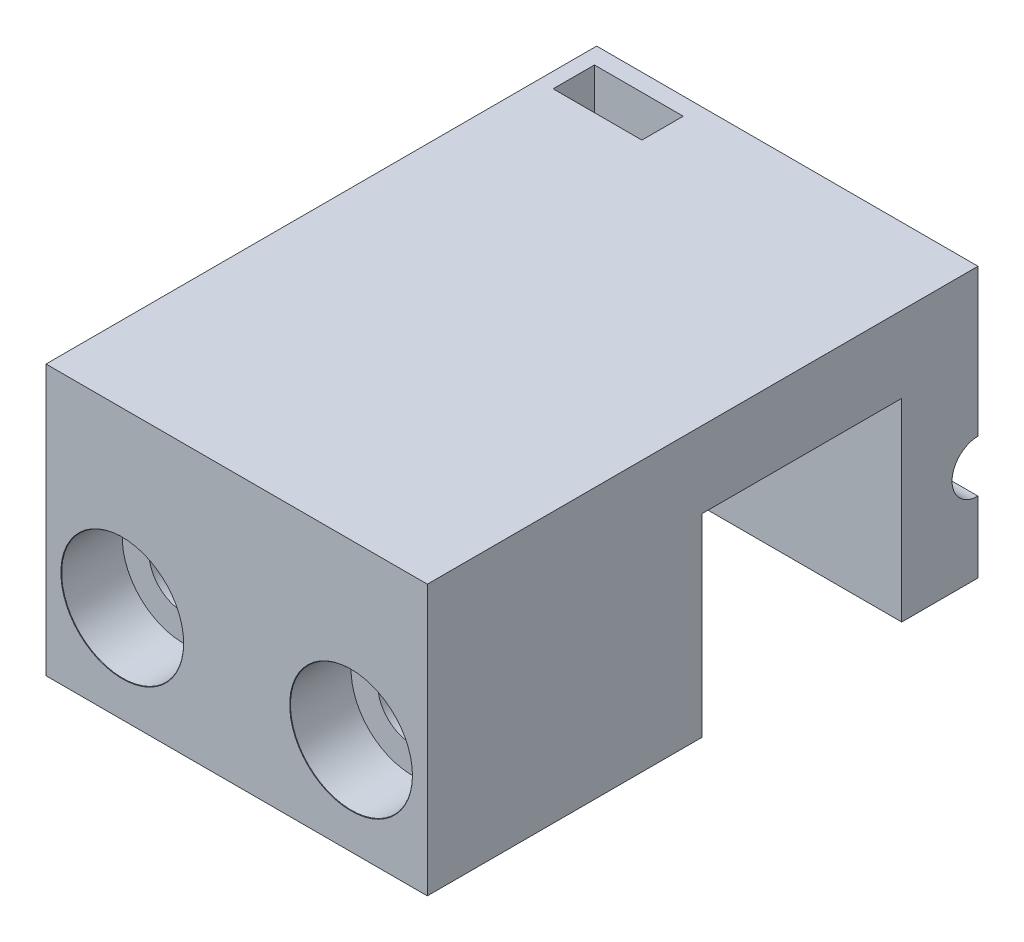
ISO-10303-21;
HEADER;
FILE_DESCRIPTION(('STEP AP214'),'2;1');
FILE_NAME('part.step','',(''),(''),'','','');
FILE_SCHEMA(('AUTOMOTIVE_DESIGN { 1 0 10303 214 1 1 1 1 }'));
ENDSEC;
DATA;
#1=APPLICATION_CONTEXT('core data for automotive mechanical design processes');
#2=APPLICATION_PROTOCOL_DEFINITION('international standard','automotive_design',2000,#1);
#3=PRODUCT_CONTEXT('',#1,'mechanical');
#4=PRODUCT('Part','Part','',(#3));
#5=PRODUCT_RELATED_PRODUCT_CATEGORY('part','',(#4));
#6=PRODUCT_DEFINITION_FORMATION('','',#4);
#7=PRODUCT_DEFINITION_CONTEXT('part definition',#1,'design');
#8=PRODUCT_DEFINITION('design','',#6,#7);
#9=PRODUCT_DEFINITION_SHAPE('','',#8);
#10=(LENGTH_UNIT() NAMED_UNIT(*) SI_UNIT(.MILLI.,.METRE.));
#11=(NAMED_UNIT(*) PLANE_ANGLE_UNIT() SI_UNIT($,.RADIAN.));
#12=(NAMED_UNIT(*) SI_UNIT($,.STERADIAN.) SOLID_ANGLE_UNIT());
#13=UNCERTAINTY_MEASURE_WITH_UNIT(LENGTH_MEASURE(1.E-05),#10,'distance_accuracy_value','');
#14=(GEOMETRIC_REPRESENTATION_CONTEXT(3) GLOBAL_UNCERTAINTY_ASSIGNED_CONTEXT((#13)) GLOBAL_UNIT_ASSIGNED_CONTEXT((#10,
#11,#12)) REPRESENTATION_CONTEXT('',''));
#15=CARTESIAN_POINT('',(0.,0.,0.));
#16=DIRECTION('',(0.,0.,1.));
#17=DIRECTION('',(1.,0.,0.));
#18=AXIS2_PLACEMENT_3D('',#15,#16,#17);
#19=CARTESIAN_POINT('',(-8.59,4.025,-18.1));
#20=DIRECTION('',(0.,0.,-1.));
#21=DIRECTION('',(-1.,0.,0.));
#22=AXIS2_PLACEMENT_3D('',#19,#20,#21);
#23=CYLINDRICAL_SURFACE('',#22,1.7);
#24=CARTESIAN_POINT('',(-8.59,4.025,-14.245));
#25=DIRECTION('',(0.,0.,1.));
#26=DIRECTION('',(1.,0.,0.));
#27=AXIS2_PLACEMENT_3D('',#24,#25,#26);
#28=CIRCLE('',#27,1.7);
#29=CARTESIAN_POINT('',(-6.89,4.025,-14.245));
#30=VERTEX_POINT('',#29);
#31=EDGE_CURVE('E47',#30,#30,#28,.F.);
#32=ORIENTED_EDGE('',*,*,#31,.T.);
#33=EDGE_LOOP('',(#32));
#34=FACE_BOUND('',#33,.T.);
#35=CARTESIAN_POINT('',(-8.59,4.025,-13.1));
#36=DIRECTION('',(0.,0.,-1.));
#37=DIRECTION('',(-1.,0.,0.));
#38=AXIS2_PLACEMENT_3D('',#35,#36,#37);
#39=CIRCLE('',#38,1.7);
#40=CARTESIAN_POINT('',(-10.29,4.025,-13.1));
#41=VERTEX_POINT('',#40);
#42=EDGE_CURVE('E265',#41,#41,#39,.F.);
#43=ORIENTED_EDGE('',*,*,#42,.T.);
#44=EDGE_LOOP('',(#43));
#45=FACE_BOUND('',#44,.T.);
#46=ADVANCED_FACE('F43',(#34,#45),#23,.F.);
#47=CARTESIAN_POINT('',(-8.59,-4.025,-18.1));
#48=DIRECTION('',(0.,0.,-1.));
#49=DIRECTION('',(-1.,0.,0.));
#50=AXIS2_PLACEMENT_3D('',#47,#48,#49);
#51=CYLINDRICAL_SURFACE('',#50,1.7);
#52=CARTESIAN_POINT('',(-8.59,-4.025,-14.245));
#53=DIRECTION('',(0.,0.,1.));
#54=DIRECTION('',(1.,0.,0.));
#55=AXIS2_PLACEMENT_3D('',#52,#53,#54);
#56=CIRCLE('',#55,1.7);
#57=CARTESIAN_POINT('',(-6.89,-4.025,-14.245));
#58=VERTEX_POINT('',#57);
#59=EDGE_CURVE('E275',#58,#58,#56,.F.);
#60=ORIENTED_EDGE('',*,*,#59,.T.);
#61=EDGE_LOOP('',(#60));
#62=FACE_BOUND('',#61,.T.);
#63=CARTESIAN_POINT('',(-8.59,-4.025,-13.1));
#64=DIRECTION('',(0.,0.,-1.));
#65=DIRECTION('',(-1.,0.,0.));
#66=AXIS2_PLACEMENT_3D('',#63,#64,#65);
#67=CIRCLE('',#66,1.7);
#68=CARTESIAN_POINT('',(-10.29,-4.025,-13.1));
#69=VERTEX_POINT('',#68);
#70=EDGE_CURVE('E279',#69,#69,#67,.F.);
#71=ORIENTED_EDGE('',*,*,#70,.T.);
#72=EDGE_LOOP('',(#71));
#73=FACE_BOUND('',#72,.T.);
#74=ADVANCED_FACE('F464',(#62,#73),#51,.F.);
#75=CARTESIAN_POINT('',(0.,0.,-13.1));
#76=DIRECTION('',(0.,0.,-1.));
#77=DIRECTION('',(-1.,0.,0.));
#78=AXIS2_PLACEMENT_3D('',#75,#76,#77);
#79=PLANE('',#78);
#80=DIRECTION('',(0.,-1.,0.));
#81=VECTOR('',#80,1.);
#82=CARTESIAN_POINT('',(12.5,11.35,-13.1));
#83=LINE('',#82,#81);
#84=CARTESIAN_POINT('',(12.5,6.35,-13.1));
#85=VERTEX_POINT('',#84);
#86=CARTESIAN_POINT('',(12.5,-6.35,-13.1));
#87=VERTEX_POINT('',#86);
#88=EDGE_CURVE('E305',#85,#87,#83,.T.);
#89=ORIENTED_EDGE('',*,*,#88,.F.);
#90=DIRECTION('',(-1.,0.,0.));
#91=VECTOR('',#90,1.);
#92=CARTESIAN_POINT('',(12.5,6.35,-13.1));
#93=LINE('',#92,#91);
#94=CARTESIAN_POINT('',(-12.5,6.35,-13.1));
#95=VERTEX_POINT('',#94);
#96=EDGE_CURVE('E343',#85,#95,#93,.T.);
#97=ORIENTED_EDGE('',*,*,#96,.T.);
#98=DIRECTION('',(0.,1.,0.));
#99=VECTOR('',#98,1.);
#100=CARTESIAN_POINT('',(-12.5,11.35,-13.1));
#101=LINE('',#100,#99);
#102=CARTESIAN_POINT('',(-12.5,-6.35,-13.1));
#103=VERTEX_POINT('',#102);
#104=EDGE_CURVE('E331',#103,#95,#101,.T.);
#105=ORIENTED_EDGE('',*,*,#104,.F.);
#106=DIRECTION('',(-1.,0.,0.));
#107=VECTOR('',#106,1.);
#108=CARTESIAN_POINT('',(12.5,-6.35,-13.1));
#109=LINE('',#108,#107);
#110=EDGE_CURVE('E328',#87,#103,#109,.T.);
#111=ORIENTED_EDGE('',*,*,#110,.F.);
#112=EDGE_LOOP('',(#89,#97,#105,#111));
#113=FACE_BOUND('',#112,.T.);
#114=ORIENTED_EDGE('',*,*,#70,.F.);
#115=EDGE_LOOP('',(#114));
#116=FACE_BOUND('',#115,.T.);
#117=ORIENTED_EDGE('',*,*,#42,.F.);
#118=EDGE_LOOP('',(#117));
#119=FACE_BOUND('',#118,.T.);
#120=ADVANCED_FACE('F470',(#113,#116,#119),#79,.F.);
#121=CARTESIAN_POINT('',(12.5,6.35,18.));
#122=DIRECTION('',(1.,0.,0.));
#123=DIRECTION('',(0.,0.,-1.));
#124=AXIS2_PLACEMENT_3D('',#121,#122,#123);
#125=PLANE('',#124);
#126=CARTESIAN_POINT('',(12.5,0.,-18.1));
#127=DIRECTION('',(1.,0.,0.));
#128=DIRECTION('',(0.,0.,-1.));
#129=AXIS2_PLACEMENT_3D('',#126,#127,#128);
#130=CIRCLE('',#129,1.7);
#131=CARTESIAN_POINT('',(12.5,1.7,-18.1));
#132=VERTEX_POINT('',#131);
#133=CARTESIAN_POINT('',(12.5,-1.7,-18.1));
#134=VERTEX_POINT('',#133);
#135=EDGE_CURVE('E302',#132,#134,#130,.T.);
#136=ORIENTED_EDGE('',*,*,#135,.F.);
#137=DIRECTION('',(0.,-1.,0.));
#138=VECTOR('',#137,1.);
#139=CARTESIAN_POINT('',(12.5,11.35,-18.1));
#140=LINE('',#139,#138);
#141=CARTESIAN_POINT('',(12.5,11.35,-18.1));
#142=VERTEX_POINT('',#141);
#143=EDGE_CURVE('E309',#142,#132,#140,.T.);
#144=ORIENTED_EDGE('',*,*,#143,.F.);
#145=DIRECTION('',(0.,0.,-1.));
#146=VECTOR('',#145,1.);
#147=CARTESIAN_POINT('',(12.5,11.35,0.));
#148=LINE('',#147,#146);
#149=CARTESIAN_POINT('',(12.5,11.35,18.));
#150=VERTEX_POINT('',#149);
#151=EDGE_CURVE('E366',#150,#142,#148,.T.);
#152=ORIENTED_EDGE('',*,*,#151,.F.);
#153=DIRECTION('',(0.,-1.,0.));
#154=VECTOR('',#153,1.);
#155=CARTESIAN_POINT('',(12.5,6.35,18.));
#156=LINE('',#155,#154);
#157=CARTESIAN_POINT('',(12.5,-6.35,18.));
#158=VERTEX_POINT('',#157);
#159=EDGE_CURVE('E410',#150,#158,#156,.T.);
#160=ORIENTED_EDGE('',*,*,#159,.T.);
#161=DIRECTION('',(0.,0.,-1.));
#162=VECTOR('',#161,1.);
#163=CARTESIAN_POINT('',(12.5,-6.35,18.));
#164=LINE('',#163,#162);
#165=CARTESIAN_POINT('',(12.5,-6.35,0.));
#166=VERTEX_POINT('',#165);
#167=EDGE_CURVE('E53',#158,#166,#164,.T.);
#168=ORIENTED_EDGE('',*,*,#167,.T.);
#169=DIRECTION('',(0.,-1.,0.));
#170=VECTOR('',#169,1.);
#171=CARTESIAN_POINT('',(12.5,6.35,0.));
#172=LINE('',#171,#170);
#173=CARTESIAN_POINT('',(12.5,6.35,0.));
#174=VERTEX_POINT('',#173);
#175=EDGE_CURVE('E409',#174,#166,#172,.T.);
#176=ORIENTED_EDGE('',*,*,#175,.F.);
#177=DIRECTION('',(0.,0.,1.));
#178=VECTOR('',#177,1.);
#179=CARTESIAN_POINT('',(12.5,6.35,-13.1));
#180=LINE('',#179,#178);
#181=EDGE_CURVE('E354',#85,#174,#180,.T.);
#182=ORIENTED_EDGE('',*,*,#181,.F.);
#183=ORIENTED_EDGE('',*,*,#88,.T.);
#184=DIRECTION('',(0.,0.,1.));
#185=VECTOR('',#184,1.);
#186=CARTESIAN_POINT('',(12.5,-6.35,-18.1));
#187=LINE('',#186,#185);
#188=CARTESIAN_POINT('',(12.5,-6.35,-18.1));
#189=VERTEX_POINT('',#188);
#190=EDGE_CURVE('E338',#189,#87,#187,.T.);
#191=ORIENTED_EDGE('',*,*,#190,.F.);
#192=EDGE_CURVE('E314',#134,#189,#140,.T.);
#193=ORIENTED_EDGE('',*,*,#192,.F.);
#194=EDGE_LOOP('',(#136,#144,#152,#160,#168,#176,#182,#183,#191,#193));
#195=FACE_BOUND('',#194,.T.);
#196=ADVANCED_FACE('F45',(#195),#125,.T.);
#197=CARTESIAN_POINT('',(0.,0.,-18.1));
#198=DIRECTION('',(0.,0.,-1.));
#199=DIRECTION('',(-1.,0.,0.));
#200=AXIS2_PLACEMENT_3D('',#197,#198,#199);
#201=PLANE('',#200);
#202=CARTESIAN_POINT('',(-8.59,4.025,-18.1));
#203=DIRECTION('',(0.,0.,-1.));
#204=DIRECTION('',(-1.,0.,0.));
#205=AXIS2_PLACEMENT_3D('',#202,#203,#204);
#206=CIRCLE('',#205,1.725);
#207=CARTESIAN_POINT('',(-10.315,4.025,-18.1));
#208=VERTEX_POINT('',#207);
#209=EDGE_CURVE('E271',#208,#208,#206,.T.);
#210=ORIENTED_EDGE('',*,*,#209,.F.);
#211=EDGE_LOOP('',(#210));
#212=FACE_BOUND('',#211,.T.);
#213=CARTESIAN_POINT('',(-8.59,-4.025,-18.1));
#214=DIRECTION('',(0.,0.,-1.));
#215=DIRECTION('',(-1.,0.,0.));
#216=AXIS2_PLACEMENT_3D('',#213,#214,#215);
#217=CIRCLE('',#216,1.725);
#218=CARTESIAN_POINT('',(-10.315,-4.025,-18.1));
#219=VERTEX_POINT('',#218);
#220=EDGE_CURVE('E269',#219,#219,#217,.T.);
#221=ORIENTED_EDGE('',*,*,#220,.F.);
#222=EDGE_LOOP('',(#221));
#223=FACE_BOUND('',#222,.T.);
#224=ORIENTED_EDGE('',*,*,#143,.T.);
#225=DIRECTION('',(-1.,0.,0.));
#226=VECTOR('',#225,1.);
#227=CARTESIAN_POINT('',(71.6806028188291,1.7,-18.1));
#228=LINE('',#227,#226);
#229=CARTESIAN_POINT('',(-4.68,1.7,-18.1));
#230=VERTEX_POINT('',#229);
#231=EDGE_CURVE('E298',#132,#230,#228,.T.);
#232=ORIENTED_EDGE('',*,*,#231,.T.);
#233=DIRECTION('',(0.,-1.,0.));
#234=VECTOR('',#233,1.);
#235=CARTESIAN_POINT('',(-4.68,11.35,-18.1));
#236=LINE('',#235,#234);
#237=CARTESIAN_POINT('',(-4.68,-1.7,-18.1));
#238=VERTEX_POINT('',#237);
#239=EDGE_CURVE('E283',#230,#238,#236,.T.);
#240=ORIENTED_EDGE('',*,*,#239,.T.);
#241=DIRECTION('',(-1.,0.,0.));
#242=VECTOR('',#241,1.);
#243=CARTESIAN_POINT('',(71.6806028188291,-1.7,-18.1));
#244=LINE('',#243,#242);
#245=EDGE_CURVE('E295',#134,#238,#244,.T.);
#246=ORIENTED_EDGE('',*,*,#245,.F.);
#247=ORIENTED_EDGE('',*,*,#192,.T.);
#248=DIRECTION('',(-1.,0.,0.));
#249=VECTOR('',#248,1.);
#250=CARTESIAN_POINT('',(12.5,-6.35,-18.1));
#251=LINE('',#250,#249);
#252=CARTESIAN_POINT('',(-12.5,-6.35,-18.1));
#253=VERTEX_POINT('',#252);
#254=EDGE_CURVE('E313',#189,#253,#251,.T.);
#255=ORIENTED_EDGE('',*,*,#254,.T.);
#256=DIRECTION('',(0.,1.,0.));
#257=VECTOR('',#256,1.);
#258=CARTESIAN_POINT('',(-12.5,11.35,-18.1));
#259=LINE('',#258,#257);
#260=CARTESIAN_POINT('',(-12.5,11.35,-18.1));
#261=VERTEX_POINT('',#260);
#262=EDGE_CURVE('E317',#253,#261,#259,.T.);
#263=ORIENTED_EDGE('',*,*,#262,.T.);
#264=DIRECTION('',(1.,0.,0.));
#265=VECTOR('',#264,1.);
#266=CARTESIAN_POINT('',(12.5,11.35,-18.1));
#267=LINE('',#266,#265);
#268=EDGE_CURVE('E321',#261,#142,#267,.T.);
#269=ORIENTED_EDGE('',*,*,#268,.T.);
#270=EDGE_LOOP('',(#224,#232,#240,#246,#247,#255,#263,#269));
#271=FACE_BOUND('',#270,.T.);
#272=ADVANCED_FACE('F491',(#212,#223,#271),#201,.T.);
#273=CARTESIAN_POINT('',(-12.5,6.35,18.));
#274=DIRECTION('',(-1.,0.,0.));
#275=DIRECTION('',(0.,0.,1.));
#276=AXIS2_PLACEMENT_3D('',#273,#274,#275);
#277=PLANE('',#276);
#278=DIRECTION('',(0.,1.,0.));
#279=VECTOR('',#278,1.);
#280=CARTESIAN_POINT('',(-12.5,6.35,0.));
#281=LINE('',#280,#279);
#282=CARTESIAN_POINT('',(-12.5,-6.35,0.));
#283=VERTEX_POINT('',#282);
#284=CARTESIAN_POINT('',(-12.5,6.35,0.));
#285=VERTEX_POINT('',#284);
#286=EDGE_CURVE('E415',#283,#285,#281,.T.);
#287=ORIENTED_EDGE('',*,*,#286,.F.);
#288=DIRECTION('',(0.,0.,-1.));
#289=VECTOR('',#288,1.);
#290=CARTESIAN_POINT('',(-12.5,-6.35,18.));
#291=LINE('',#290,#289);
#292=CARTESIAN_POINT('',(-12.5,-6.35,18.));
#293=VERTEX_POINT('',#292);
#294=EDGE_CURVE('E11',#293,#283,#291,.T.);
#295=ORIENTED_EDGE('',*,*,#294,.F.);
#296=DIRECTION('',(0.,1.,0.));
#297=VECTOR('',#296,1.);
#298=CARTESIAN_POINT('',(-12.5,6.35,18.));
#299=LINE('',#298,#297);
#300=CARTESIAN_POINT('',(-12.5,11.35,18.));
#301=VERTEX_POINT('',#300);
#302=EDGE_CURVE('E419',#293,#301,#299,.T.);
#303=ORIENTED_EDGE('',*,*,#302,.T.);
#304=DIRECTION('',(0.,0.,1.));
#305=VECTOR('',#304,1.);
#306=CARTESIAN_POINT('',(-12.5,11.35,0.));
#307=LINE('',#306,#305);
#308=EDGE_CURVE('E358',#261,#301,#307,.T.);
#309=ORIENTED_EDGE('',*,*,#308,.F.);
#310=ORIENTED_EDGE('',*,*,#262,.F.);
#311=DIRECTION('',(0.,0.,1.));
#312=VECTOR('',#311,1.);
#313=CARTESIAN_POINT('',(-12.5,-6.35,-18.1));
#314=LINE('',#313,#312);
#315=EDGE_CURVE('E325',#253,#103,#314,.T.);
#316=ORIENTED_EDGE('',*,*,#315,.T.);
#317=ORIENTED_EDGE('',*,*,#104,.T.);
#318=DIRECTION('',(0.,0.,1.));
#319=VECTOR('',#318,1.);
#320=CARTESIAN_POINT('',(-12.5,6.35,-13.1));
#321=LINE('',#320,#319);
#322=EDGE_CURVE('E347',#95,#285,#321,.T.);
#323=ORIENTED_EDGE('',*,*,#322,.T.);
#324=EDGE_LOOP('',(#287,#295,#303,#309,#310,#316,#317,#323));
#325=FACE_BOUND('',#324,.T.);
#326=ADVANCED_FACE('F494',(#325),#277,.T.);
#327=CARTESIAN_POINT('',(12.5,-6.35,18.));
#328=DIRECTION('',(0.,-1.,0.));
#329=DIRECTION('',(1.,0.,0.));
#330=AXIS2_PLACEMENT_3D('',#327,#328,#329);
#331=PLANE('',#330);
#332=DIRECTION('',(-1.,0.,0.));
#333=VECTOR('',#332,1.);
#334=CARTESIAN_POINT('',(12.5,-6.35,0.));
#335=LINE('',#334,#333);
#336=EDGE_CURVE('E424',#166,#283,#335,.T.);
#337=ORIENTED_EDGE('',*,*,#336,.F.);
#338=ORIENTED_EDGE('',*,*,#167,.F.);
#339=DIRECTION('',(-1.,0.,0.));
#340=VECTOR('',#339,1.);
#341=CARTESIAN_POINT('',(12.5,-6.35,18.));
#342=LINE('',#341,#340);
#343=EDGE_CURVE('E414',#158,#293,#342,.T.);
#344=ORIENTED_EDGE('',*,*,#343,.T.);
#345=ORIENTED_EDGE('',*,*,#294,.T.);
#346=EDGE_LOOP('',(#337,#338,#344,#345));
#347=FACE_BOUND('',#346,.T.);
#348=ADVANCED_FACE('F572',(#347),#331,.T.);
#349=CARTESIAN_POINT('',(0.,0.,18.));
#350=DIRECTION('',(0.,0.,-1.));
#351=DIRECTION('',(-1.,0.,0.));
#352=AXIS2_PLACEMENT_3D('',#349,#350,#351);
#353=PLANE('',#352);
#354=CARTESIAN_POINT('',(7.5,0.,18.));
#355=DIRECTION('',(0.,0.,1.));
#356=DIRECTION('',(1.,0.,0.));
#357=AXIS2_PLACEMENT_3D('',#354,#355,#356);
#358=CIRCLE('',#357,4.025);
#359=CARTESIAN_POINT('',(11.525,0.,18.));
#360=VERTEX_POINT('',#359);
#361=EDGE_CURVE('E369',#360,#360,#358,.T.);
#362=ORIENTED_EDGE('',*,*,#361,.F.);
#363=EDGE_LOOP('',(#362));
#364=FACE_BOUND('',#363,.T.);
#365=CARTESIAN_POINT('',(-7.5,0.,18.));
#366=DIRECTION('',(0.,0.,1.));
#367=DIRECTION('',(1.,0.,0.));
#368=AXIS2_PLACEMENT_3D('',#365,#366,#367);
#369=CIRCLE('',#368,4.025);
#370=CARTESIAN_POINT('',(-3.475,0.,18.));
#371=VERTEX_POINT('',#370);
#372=EDGE_CURVE('E389',#371,#371,#369,.T.);
#373=ORIENTED_EDGE('',*,*,#372,.F.);
#374=EDGE_LOOP('',(#373));
#375=FACE_BOUND('',#374,.T.);
#376=ORIENTED_EDGE('',*,*,#159,.F.);
#377=DIRECTION('',(1.,0.,0.));
#378=VECTOR('',#377,1.);
#379=CARTESIAN_POINT('',(-12.5,11.35,18.));
#380=LINE('',#379,#378);
#381=EDGE_CURVE('E362',#301,#150,#380,.T.);
#382=ORIENTED_EDGE('',*,*,#381,.F.);
#383=ORIENTED_EDGE('',*,*,#302,.F.);
#384=ORIENTED_EDGE('',*,*,#343,.F.);
#385=EDGE_LOOP('',(#376,#382,#383,#384));
#386=FACE_BOUND('',#385,.T.);
#387=ADVANCED_FACE('F569',(#364,#375,#386),#353,.F.);
#388=CARTESIAN_POINT('',(0.,0.,0.));
#389=DIRECTION('',(0.,0.,-1.));
#390=DIRECTION('',(-1.,0.,0.));
#391=AXIS2_PLACEMENT_3D('',#388,#389,#390);
#392=PLANE('',#391);
#393=DIRECTION('',(-1.,0.,0.));
#394=VECTOR('',#393,1.);
#395=CARTESIAN_POINT('',(12.5,6.35,0.));
#396=LINE('',#395,#394);
#397=EDGE_CURVE('E342',#174,#285,#396,.T.);
#398=ORIENTED_EDGE('',*,*,#397,.F.);
#399=ORIENTED_EDGE('',*,*,#175,.T.);
#400=ORIENTED_EDGE('',*,*,#336,.T.);
#401=ORIENTED_EDGE('',*,*,#286,.T.);
#402=EDGE_LOOP('',(#398,#399,#400,#401));
#403=FACE_BOUND('',#402,.T.);
#404=CARTESIAN_POINT('',(7.5,0.,0.));
#405=DIRECTION('',(0.,0.,1.));
#406=DIRECTION('',(1.,0.,0.));
#407=AXIS2_PLACEMENT_3D('',#404,#405,#406);
#408=CIRCLE('',#407,2.25);
#409=CARTESIAN_POINT('',(9.74999999999999,0.,0.));
#410=VERTEX_POINT('',#409);
#411=EDGE_CURVE('E385',#410,#410,#408,.T.);
#412=ORIENTED_EDGE('',*,*,#411,.T.);
#413=EDGE_LOOP('',(#412));
#414=FACE_BOUND('',#413,.T.);
#415=CARTESIAN_POINT('',(-7.5,0.,0.));
#416=DIRECTION('',(0.,0.,1.));
#417=DIRECTION('',(1.,0.,0.));
#418=AXIS2_PLACEMENT_3D('',#415,#416,#417);
#419=CIRCLE('',#418,2.25);
#420=CARTESIAN_POINT('',(-5.25,0.,0.));
#421=VERTEX_POINT('',#420);
#422=EDGE_CURVE('E405',#421,#421,#419,.T.);
#423=ORIENTED_EDGE('',*,*,#422,.T.);
#424=EDGE_LOOP('',(#423));
#425=FACE_BOUND('',#424,.T.);
#426=ADVANCED_FACE('F567',(#403,#414,#425),#392,.T.);
#427=CARTESIAN_POINT('',(-7.5,0.,18.));
#428=DIRECTION('',(0.,0.,1.));
#429=DIRECTION('',(1.,0.,0.));
#430=AXIS2_PLACEMENT_3D('',#427,#428,#429);
#431=CYLINDRICAL_SURFACE('',#430,2.25);
#432=ORIENTED_EDGE('',*,*,#422,.F.);
#433=EDGE_LOOP('',(#432));
#434=FACE_BOUND('',#433,.T.);
#435=CARTESIAN_POINT('',(-7.5,0.,14.));
#436=DIRECTION('',(0.,0.,1.));
#437=DIRECTION('',(1.,0.,0.));
#438=AXIS2_PLACEMENT_3D('',#435,#436,#437);
#439=CIRCLE('',#438,2.25);
#440=CARTESIAN_POINT('',(-5.25,0.,14.));
#441=VERTEX_POINT('',#440);
#442=EDGE_CURVE('E401',#441,#441,#439,.T.);
#443=ORIENTED_EDGE('',*,*,#442,.T.);
#444=EDGE_LOOP('',(#443));
#445=FACE_BOUND('',#444,.T.);
#446=ADVANCED_FACE('F563',(#434,#445),#431,.F.);
#447=CARTESIAN_POINT('',(-3.5,0.,14.));
#448=DIRECTION('',(0.,0.,-1.));
#449=DIRECTION('',(-1.,0.,0.));
#450=AXIS2_PLACEMENT_3D('',#447,#448,#449);
#451=PLANE('',#450);
#452=ORIENTED_EDGE('',*,*,#442,.F.);
#453=EDGE_LOOP('',(#452));
#454=FACE_BOUND('',#453,.T.);
#455=CARTESIAN_POINT('',(-7.5,0.,14.));
#456=DIRECTION('',(0.,0.,1.));
#457=DIRECTION('',(1.,0.,0.));
#458=AXIS2_PLACEMENT_3D('',#455,#456,#457);
#459=CIRCLE('',#458,4.);
#460=CARTESIAN_POINT('',(-3.5,0.,14.));
#461=VERTEX_POINT('',#460);
#462=EDGE_CURVE('E397',#461,#461,#459,.T.);
#463=ORIENTED_EDGE('',*,*,#462,.T.);
#464=EDGE_LOOP('',(#463));
#465=FACE_BOUND('',#464,.T.);
#466=ADVANCED_FACE('F559',(#454,#465),#451,.F.);
#467=CARTESIAN_POINT('',(-7.5,0.,18.));
#468=DIRECTION('',(0.,0.,1.));
#469=DIRECTION('',(1.,0.,0.));
#470=AXIS2_PLACEMENT_3D('',#467,#468,#469);
#471=CYLINDRICAL_SURFACE('',#470,4.);
#472=ORIENTED_EDGE('',*,*,#462,.F.);
#473=EDGE_LOOP('',(#472));
#474=FACE_BOUND('',#473,.T.);
#475=CARTESIAN_POINT('',(-7.5,0.,17.975));
#476=DIRECTION('',(0.,0.,1.));
#477=DIRECTION('',(1.,0.,0.));
#478=AXIS2_PLACEMENT_3D('',#475,#476,#477);
#479=CIRCLE('',#478,4.);
#480=CARTESIAN_POINT('',(-3.5,0.,17.975));
#481=VERTEX_POINT('',#480);
#482=EDGE_CURVE('E393',#481,#481,#479,.T.);
#483=ORIENTED_EDGE('',*,*,#482,.T.);
#484=EDGE_LOOP('',(#483));
#485=FACE_BOUND('',#484,.T.);
#486=ADVANCED_FACE('F555',(#474,#485),#471,.F.);
#487=CARTESIAN_POINT('',(-7.5,0.,18.));
#488=DIRECTION('',(0.,0.,1.));
#489=DIRECTION('',(1.,0.,0.));
#490=AXIS2_PLACEMENT_3D('',#487,#488,#489);
#491=CONICAL_SURFACE('',#490,4.025,0.785398163397483);
#492=ORIENTED_EDGE('',*,*,#482,.F.);
#493=EDGE_LOOP('',(#492));
#494=FACE_BOUND('',#493,.T.);
#495=ORIENTED_EDGE('',*,*,#372,.T.);
#496=EDGE_LOOP('',(#495));
#497=FACE_BOUND('',#496,.T.);
#498=ADVANCED_FACE('F551',(#494,#497),#491,.F.);
#499=CARTESIAN_POINT('',(7.5,0.,18.));
#500=DIRECTION('',(0.,0.,1.));
#501=DIRECTION('',(1.,0.,0.));
#502=AXIS2_PLACEMENT_3D('',#499,#500,#501);
#503=CYLINDRICAL_SURFACE('',#502,2.25);
#504=ORIENTED_EDGE('',*,*,#411,.F.);
#505=EDGE_LOOP('',(#504));
#506=FACE_BOUND('',#505,.T.);
#507=CARTESIAN_POINT('',(7.5,0.,14.));
#508=DIRECTION('',(0.,0.,1.));
#509=DIRECTION('',(1.,0.,0.));
#510=AXIS2_PLACEMENT_3D('',#507,#508,#509);
#511=CIRCLE('',#510,2.25);
#512=CARTESIAN_POINT('',(9.75,0.,14.));
#513=VERTEX_POINT('',#512);
#514=EDGE_CURVE('E381',#513,#513,#511,.T.);
#515=ORIENTED_EDGE('',*,*,#514,.T.);
#516=EDGE_LOOP('',(#515));
#517=FACE_BOUND('',#516,.T.);
#518=ADVANCED_FACE('F547',(#506,#517),#503,.F.);
#519=CARTESIAN_POINT('',(11.5,0.,14.));
#520=DIRECTION('',(0.,0.,-1.));
#521=DIRECTION('',(-1.,0.,0.));
#522=AXIS2_PLACEMENT_3D('',#519,#520,#521);
#523=PLANE('',#522);
#524=ORIENTED_EDGE('',*,*,#514,.F.);
#525=EDGE_LOOP('',(#524));
#526=FACE_BOUND('',#525,.T.);
#527=CARTESIAN_POINT('',(7.5,0.,14.));
#528=DIRECTION('',(0.,0.,1.));
#529=DIRECTION('',(1.,0.,0.));
#530=AXIS2_PLACEMENT_3D('',#527,#528,#529);
#531=CIRCLE('',#530,4.);
#532=CARTESIAN_POINT('',(11.5,0.,14.));
#533=VERTEX_POINT('',#532);
#534=EDGE_CURVE('E377',#533,#533,#531,.T.);
#535=ORIENTED_EDGE('',*,*,#534,.T.);
#536=EDGE_LOOP('',(#535));
#537=FACE_BOUND('',#536,.T.);
#538=ADVANCED_FACE('F543',(#526,#537),#523,.F.);
#539=CARTESIAN_POINT('',(7.5,0.,18.));
#540=DIRECTION('',(0.,0.,1.));
#541=DIRECTION('',(1.,0.,0.));
#542=AXIS2_PLACEMENT_3D('',#539,#540,#541);
#543=CYLINDRICAL_SURFACE('',#542,4.);
#544=ORIENTED_EDGE('',*,*,#534,.F.);
#545=EDGE_LOOP('',(#544));
#546=FACE_BOUND('',#545,.T.);
#547=CARTESIAN_POINT('',(7.5,0.,17.975));
#548=DIRECTION('',(0.,0.,1.));
#549=DIRECTION('',(1.,0.,0.));
#550=AXIS2_PLACEMENT_3D('',#547,#548,#549);
#551=CIRCLE('',#550,4.);
#552=CARTESIAN_POINT('',(11.5,0.,17.975));
#553=VERTEX_POINT('',#552);
#554=EDGE_CURVE('E373',#553,#553,#551,.T.);
#555=ORIENTED_EDGE('',*,*,#554,.T.);
#556=EDGE_LOOP('',(#555));
#557=FACE_BOUND('',#556,.T.);
#558=ADVANCED_FACE('F539',(#546,#557),#543,.F.);
#559=CARTESIAN_POINT('',(7.5,0.,18.));
#560=DIRECTION('',(0.,0.,1.));
#561=DIRECTION('',(1.,0.,0.));
#562=AXIS2_PLACEMENT_3D('',#559,#560,#561);
#563=CONICAL_SURFACE('',#562,4.025,0.785398163397483);
#564=ORIENTED_EDGE('',*,*,#554,.F.);
#565=EDGE_LOOP('',(#564));
#566=FACE_BOUND('',#565,.T.);
#567=ORIENTED_EDGE('',*,*,#361,.T.);
#568=EDGE_LOOP('',(#567));
#569=FACE_BOUND('',#568,.T.);
#570=ADVANCED_FACE('F535',(#566,#569),#563,.F.);
#571=CARTESIAN_POINT('',(0.,11.35,0.));
#572=DIRECTION('',(0.,1.,0.));
#573=DIRECTION('',(0.,0.,1.));
#574=AXIS2_PLACEMENT_3D('',#571,#572,#573);
#575=PLANE('',#574);
#576=DIRECTION('',(0.,0.,-1.));
#577=VECTOR('',#576,1.);
#578=CARTESIAN_POINT('',(-5.68,11.35,-14.245));
#579=LINE('',#578,#577);
#580=CARTESIAN_POINT('',(-5.68,11.35,-14.245));
#581=VERTEX_POINT('',#580);
#582=CARTESIAN_POINT('',(-5.67999999999999,11.35,-16.955));
#583=VERTEX_POINT('',#582);
#584=EDGE_CURVE('E61',#581,#583,#579,.T.);
#585=ORIENTED_EDGE('',*,*,#584,.F.);
#586=DIRECTION('',(1.,0.,0.));
#587=VECTOR('',#586,1.);
#588=CARTESIAN_POINT('',(-5.68,11.35,-14.245));
#589=LINE('',#588,#587);
#590=CARTESIAN_POINT('',(-11.5,11.35,-14.245));
#591=VERTEX_POINT('',#590);
#592=EDGE_CURVE('E194',#591,#581,#589,.T.);
#593=ORIENTED_EDGE('',*,*,#592,.F.);
#594=DIRECTION('',(0.,0.,1.));
#595=VECTOR('',#594,1.);
#596=CARTESIAN_POINT('',(-11.5,11.35,-14.245));
#597=LINE('',#596,#595);
#598=CARTESIAN_POINT('',(-11.5,11.35,-16.955));
#599=VERTEX_POINT('',#598);
#600=EDGE_CURVE('E198',#599,#591,#597,.T.);
#601=ORIENTED_EDGE('',*,*,#600,.F.);
#602=DIRECTION('',(-1.,0.,0.));
#603=VECTOR('',#602,1.);
#604=CARTESIAN_POINT('',(-5.67999999999999,11.35,-16.955));
#605=LINE('',#604,#603);
#606=EDGE_CURVE('E207',#583,#599,#605,.T.);
#607=ORIENTED_EDGE('',*,*,#606,.F.);
#608=EDGE_LOOP('',(#585,#593,#601,#607));
#609=FACE_BOUND('',#608,.T.);
#610=ORIENTED_EDGE('',*,*,#308,.T.);
#611=ORIENTED_EDGE('',*,*,#381,.T.);
#612=ORIENTED_EDGE('',*,*,#151,.T.);
#613=ORIENTED_EDGE('',*,*,#268,.F.);
#614=EDGE_LOOP('',(#610,#611,#612,#613));
#615=FACE_BOUND('',#614,.T.);
#616=ADVANCED_FACE('F531',(#609,#615),#575,.T.);
#617=CARTESIAN_POINT('',(12.5,6.35,-13.1));
#618=DIRECTION('',(0.,1.,0.));
#619=DIRECTION('',(-1.,0.,0.));
#620=AXIS2_PLACEMENT_3D('',#617,#618,#619);
#621=PLANE('',#620);
#622=ORIENTED_EDGE('',*,*,#397,.T.);
#623=ORIENTED_EDGE('',*,*,#322,.F.);
#624=ORIENTED_EDGE('',*,*,#96,.F.);
#625=ORIENTED_EDGE('',*,*,#181,.T.);
#626=EDGE_LOOP('',(#622,#623,#624,#625));
#627=FACE_BOUND('',#626,.T.);
#628=ADVANCED_FACE('F527',(#627),#621,.F.);
#629=CARTESIAN_POINT('',(12.5,-6.35,-18.1));
#630=DIRECTION('',(0.,1.,0.));
#631=DIRECTION('',(0.,0.,1.));
#632=AXIS2_PLACEMENT_3D('',#629,#630,#631);
#633=PLANE('',#632);
#634=DIRECTION('',(1.,0.,0.));
#635=VECTOR('',#634,1.);
#636=CARTESIAN_POINT('',(-11.5,-6.35,-16.955));
#637=LINE('',#636,#635);
#638=CARTESIAN_POINT('',(-11.5,-6.35,-16.955));
#639=VERTEX_POINT('',#638);
#640=CARTESIAN_POINT('',(-5.68,-6.35,-16.955));
#641=VERTEX_POINT('',#640);
#642=EDGE_CURVE('E242',#639,#641,#637,.T.);
#643=ORIENTED_EDGE('',*,*,#642,.F.);
#644=DIRECTION('',(0.,0.,-1.));
#645=VECTOR('',#644,1.);
#646=CARTESIAN_POINT('',(-11.5,-6.35,-14.245));
#647=LINE('',#646,#645);
#648=CARTESIAN_POINT('',(-11.5,-6.35,-14.245));
#649=VERTEX_POINT('',#648);
#650=EDGE_CURVE('E69',#649,#639,#647,.T.);
#651=ORIENTED_EDGE('',*,*,#650,.F.);
#652=DIRECTION('',(-1.,0.,0.));
#653=VECTOR('',#652,1.);
#654=CARTESIAN_POINT('',(-11.5,-6.35,-14.245));
#655=LINE('',#654,#653);
#656=CARTESIAN_POINT('',(-5.68,-6.35,-14.245));
#657=VERTEX_POINT('',#656);
#658=EDGE_CURVE('E227',#657,#649,#655,.T.);
#659=ORIENTED_EDGE('',*,*,#658,.F.);
#660=DIRECTION('',(0.,0.,1.));
#661=VECTOR('',#660,1.);
#662=CARTESIAN_POINT('',(-5.68,-6.35,-14.245));
#663=LINE('',#662,#661);
#664=EDGE_CURVE('E246',#641,#657,#663,.T.);
#665=ORIENTED_EDGE('',*,*,#664,.F.);
#666=EDGE_LOOP('',(#643,#651,#659,#665));
#667=FACE_BOUND('',#666,.T.);
#668=ORIENTED_EDGE('',*,*,#110,.T.);
#669=ORIENTED_EDGE('',*,*,#315,.F.);
#670=ORIENTED_EDGE('',*,*,#254,.F.);
#671=ORIENTED_EDGE('',*,*,#190,.T.);
#672=EDGE_LOOP('',(#668,#669,#670,#671));
#673=FACE_BOUND('',#672,.T.);
#674=ADVANCED_FACE('F519',(#667,#673),#633,.F.);
#675=CARTESIAN_POINT('',(71.6806028188291,0.,-18.1));
#676=DIRECTION('',(-1.,0.,0.));
#677=DIRECTION('',(0.,0.,1.));
#678=AXIS2_PLACEMENT_3D('',#675,#676,#677);
#679=CYLINDRICAL_SURFACE('',#678,1.7);
#680=ORIENTED_EDGE('',*,*,#231,.F.);
#681=ORIENTED_EDGE('',*,*,#135,.T.);
#682=ORIENTED_EDGE('',*,*,#245,.T.);
#683=CARTESIAN_POINT('',(-4.68,0.,-18.1));
#684=DIRECTION('',(1.,0.,0.));
#685=DIRECTION('',(0.,0.,-1.));
#686=AXIS2_PLACEMENT_3D('',#683,#684,#685);
#687=CIRCLE('',#686,1.7);
#688=EDGE_CURVE('E291',#230,#238,#687,.T.);
#689=ORIENTED_EDGE('',*,*,#688,.F.);
#690=EDGE_LOOP('',(#680,#681,#682,#689));
#691=FACE_BOUND('',#690,.T.);
#692=ADVANCED_FACE('F507',(#691),#679,.F.);
#693=CARTESIAN_POINT('',(-4.68,6.35,18.));
#694=DIRECTION('',(1.,0.,0.));
#695=DIRECTION('',(0.,0.,-1.));
#696=AXIS2_PLACEMENT_3D('',#693,#694,#695);
#697=PLANE('',#696);
#698=ORIENTED_EDGE('',*,*,#688,.T.);
#699=ORIENTED_EDGE('',*,*,#239,.F.);
#700=EDGE_LOOP('',(#698,#699));
#701=FACE_BOUND('',#700,.T.);
#702=ADVANCED_FACE('F511',(#701),#697,.T.);
#703=CARTESIAN_POINT('',(-8.59,-4.025,-16.955));
#704=DIRECTION('',(0.,0.,-1.));
#705=DIRECTION('',(-1.,0.,0.));
#706=AXIS2_PLACEMENT_3D('',#703,#704,#705);
#707=CIRCLE('',#706,1.7);
#708=CARTESIAN_POINT('',(-10.29,-4.025,-16.955));
#709=VERTEX_POINT('',#708);
#710=EDGE_CURVE('E256',#709,#709,#707,.F.);
#711=ORIENTED_EDGE('',*,*,#710,.T.);
#712=EDGE_LOOP('',(#711));
#713=FACE_BOUND('',#712,.T.);
#714=CARTESIAN_POINT('',(-8.59,-4.025,-18.075));
#715=DIRECTION('',(0.,0.,-1.));
#716=DIRECTION('',(-1.,0.,0.));
#717=AXIS2_PLACEMENT_3D('',#714,#715,#716);
#718=CIRCLE('',#717,1.7);
#719=CARTESIAN_POINT('',(-10.29,-4.025,-18.075));
#720=VERTEX_POINT('',#719);
#721=EDGE_CURVE('E284',#720,#720,#718,.T.);
#722=ORIENTED_EDGE('',*,*,#721,.T.);
#723=EDGE_LOOP('',(#722));
#724=FACE_BOUND('',#723,.T.);
#725=ADVANCED_FACE('F473',(#713,#724),#51,.F.);
#726=CARTESIAN_POINT('',(-8.59,-4.025,-18.1));
#727=DIRECTION('',(0.,0.,-1.));
#728=DIRECTION('',(-1.,0.,0.));
#729=AXIS2_PLACEMENT_3D('',#726,#727,#728);
#730=CONICAL_SURFACE('',#729,1.725,0.785398163397448);
#731=ORIENTED_EDGE('',*,*,#721,.F.);
#732=EDGE_LOOP('',(#731));
#733=FACE_BOUND('',#732,.T.);
#734=ORIENTED_EDGE('',*,*,#220,.T.);
#735=EDGE_LOOP('',(#734));
#736=FACE_BOUND('',#735,.T.);
#737=ADVANCED_FACE('F478',(#733,#736),#730,.F.);
#738=CARTESIAN_POINT('',(-8.59,4.025,-16.955));
#739=DIRECTION('',(0.,0.,-1.));
#740=DIRECTION('',(-1.,0.,0.));
#741=AXIS2_PLACEMENT_3D('',#738,#739,#740);
#742=CIRCLE('',#741,1.7);
#743=CARTESIAN_POINT('',(-10.29,4.025,-16.955));
#744=VERTEX_POINT('',#743);
#745=EDGE_CURVE('E216',#744,#744,#742,.F.);
#746=ORIENTED_EDGE('',*,*,#745,.T.);
#747=EDGE_LOOP('',(#746));
#748=FACE_BOUND('',#747,.T.);
#749=CARTESIAN_POINT('',(-8.59,4.025,-18.075));
#750=DIRECTION('',(0.,0.,-1.));
#751=DIRECTION('',(-1.,0.,0.));
#752=AXIS2_PLACEMENT_3D('',#749,#750,#751);
#753=CIRCLE('',#752,1.7);
#754=CARTESIAN_POINT('',(-10.29,4.025,-18.075));
#755=VERTEX_POINT('',#754);
#756=EDGE_CURVE('E270',#755,#755,#753,.T.);
#757=ORIENTED_EDGE('',*,*,#756,.T.);
#758=EDGE_LOOP('',(#757));
#759=FACE_BOUND('',#758,.T.);
#760=ADVANCED_FACE('F466',(#748,#759),#23,.F.);
#761=CARTESIAN_POINT('',(-8.59,4.025,-18.1));
#762=DIRECTION('',(0.,0.,-1.));
#763=DIRECTION('',(-1.,0.,0.));
#764=AXIS2_PLACEMENT_3D('',#761,#762,#763);
#765=CONICAL_SURFACE('',#764,1.725,0.785398163397448);
#766=ORIENTED_EDGE('',*,*,#756,.F.);
#767=EDGE_LOOP('',(#766));
#768=FACE_BOUND('',#767,.T.);
#769=ORIENTED_EDGE('',*,*,#209,.T.);
#770=EDGE_LOOP('',(#769));
#771=FACE_BOUND('',#770,.T.);
#772=ADVANCED_FACE('F477',(#768,#771),#765,.F.);
#773=CARTESIAN_POINT('',(-11.5,-0.530000000000001,-14.245));
#774=DIRECTION('',(0.,0.,1.));
#775=DIRECTION('',(1.,0.,0.));
#776=AXIS2_PLACEMENT_3D('',#773,#774,#775);
#777=PLANE('',#776);
#778=ORIENTED_EDGE('',*,*,#658,.T.);
#779=DIRECTION('',(0.,-1.,0.));
#780=VECTOR('',#779,1.);
#781=CARTESIAN_POINT('',(-11.5,-0.530000000000001,-14.245));
#782=LINE('',#781,#780);
#783=CARTESIAN_POINT('',(-11.5,-0.530000000000001,-14.245));
#784=VERTEX_POINT('',#783);
#785=EDGE_CURVE('E253',#784,#649,#782,.T.);
#786=ORIENTED_EDGE('',*,*,#785,.F.);
#787=DIRECTION('',(-1.,0.,0.));
#788=VECTOR('',#787,1.);
#789=CARTESIAN_POINT('',(-11.5,-0.530000000000001,-14.245));
#790=LINE('',#789,#788);
#791=CARTESIAN_POINT('',(-5.68,-0.530000000000001,-14.245));
#792=VERTEX_POINT('',#791);
#793=EDGE_CURVE('E235',#792,#784,#790,.T.);
#794=ORIENTED_EDGE('',*,*,#793,.F.);
#795=DIRECTION('',(0.,-1.,0.));
#796=VECTOR('',#795,1.);
#797=CARTESIAN_POINT('',(-5.68,-0.530000000000001,-14.245));
#798=LINE('',#797,#796);
#799=EDGE_CURVE('E257',#792,#657,#798,.T.);
#800=ORIENTED_EDGE('',*,*,#799,.T.);
#801=EDGE_LOOP('',(#778,#786,#794,#800));
#802=FACE_BOUND('',#801,.T.);
#803=ORIENTED_EDGE('',*,*,#59,.F.);
#804=EDGE_LOOP('',(#803));
#805=FACE_BOUND('',#804,.T.);
#806=ADVANCED_FACE('F483',(#802,#805),#777,.F.);
#807=CARTESIAN_POINT('',(-11.5,-0.530000000000001,-16.955));
#808=DIRECTION('',(0.,0.,-1.));
#809=DIRECTION('',(-1.,0.,0.));
#810=AXIS2_PLACEMENT_3D('',#807,#808,#809);
#811=PLANE('',#810);
#812=ORIENTED_EDGE('',*,*,#642,.T.);
#813=DIRECTION('',(0.,-1.,0.));
#814=VECTOR('',#813,1.);
#815=CARTESIAN_POINT('',(-5.68,-0.530000000000001,-16.955));
#816=LINE('',#815,#814);
#817=CARTESIAN_POINT('',(-5.68,-0.530000000000001,-16.955));
#818=VERTEX_POINT('',#817);
#819=EDGE_CURVE('E260',#818,#641,#816,.T.);
#820=ORIENTED_EDGE('',*,*,#819,.F.);
#821=DIRECTION('',(1.,0.,0.));
#822=VECTOR('',#821,1.);
#823=CARTESIAN_POINT('',(-11.5,-0.530000000000001,-16.955));
#824=LINE('',#823,#822);
#825=CARTESIAN_POINT('',(-11.5,-0.530000000000001,-16.955));
#826=VERTEX_POINT('',#825);
#827=EDGE_CURVE('E226',#826,#818,#824,.T.);
#828=ORIENTED_EDGE('',*,*,#827,.F.);
#829=DIRECTION('',(0.,-1.,0.));
#830=VECTOR('',#829,1.);
#831=CARTESIAN_POINT('',(-11.5,-0.530000000000001,-16.955));
#832=LINE('',#831,#830);
#833=EDGE_CURVE('E239',#826,#639,#832,.T.);
#834=ORIENTED_EDGE('',*,*,#833,.T.);
#835=EDGE_LOOP('',(#812,#820,#828,#834));
#836=FACE_BOUND('',#835,.T.);
#837=ORIENTED_EDGE('',*,*,#710,.F.);
#838=EDGE_LOOP('',(#837));
#839=FACE_BOUND('',#838,.T.);
#840=ADVANCED_FACE('F743',(#836,#839),#811,.F.);
#841=CARTESIAN_POINT('',(-11.5,-0.530000000000001,-14.245));
#842=DIRECTION('',(-1.,0.,0.));
#843=DIRECTION('',(0.,0.,1.));
#844=AXIS2_PLACEMENT_3D('',#841,#842,#843);
#845=PLANE('',#844);
#846=ORIENTED_EDGE('',*,*,#650,.T.);
#847=ORIENTED_EDGE('',*,*,#833,.F.);
#848=DIRECTION('',(0.,0.,-1.));
#849=VECTOR('',#848,1.);
#850=CARTESIAN_POINT('',(-11.5,-0.530000000000001,-14.245));
#851=LINE('',#850,#849);
#852=EDGE_CURVE('E222',#784,#826,#851,.T.);
#853=ORIENTED_EDGE('',*,*,#852,.F.);
#854=ORIENTED_EDGE('',*,*,#785,.T.);
#855=EDGE_LOOP('',(#846,#847,#853,#854));
#856=FACE_BOUND('',#855,.T.);
#857=ADVANCED_FACE('F753',(#856),#845,.F.);
#858=CARTESIAN_POINT('',(-5.68,-0.530000000000001,-14.245));
#859=DIRECTION('',(1.,0.,0.));
#860=DIRECTION('',(0.,0.,-1.));
#861=AXIS2_PLACEMENT_3D('',#858,#859,#860);
#862=PLANE('',#861);
#863=ORIENTED_EDGE('',*,*,#664,.T.);
#864=ORIENTED_EDGE('',*,*,#799,.F.);
#865=DIRECTION('',(0.,0.,1.));
#866=VECTOR('',#865,1.);
#867=CARTESIAN_POINT('',(-5.68,-0.530000000000001,-14.245));
#868=LINE('',#867,#866);
#869=EDGE_CURVE('E231',#818,#792,#868,.T.);
#870=ORIENTED_EDGE('',*,*,#869,.F.);
#871=ORIENTED_EDGE('',*,*,#819,.T.);
#872=EDGE_LOOP('',(#863,#864,#870,#871));
#873=FACE_BOUND('',#872,.T.);
#874=ADVANCED_FACE('F458',(#873),#862,.F.);
#875=CARTESIAN_POINT('',(0.,-0.530000000000001,0.));
#876=DIRECTION('',(0.,-1.,0.));
#877=DIRECTION('',(0.,0.,-1.));
#878=AXIS2_PLACEMENT_3D('',#875,#876,#877);
#879=PLANE('',#878);
#880=ORIENTED_EDGE('',*,*,#852,.T.);
#881=ORIENTED_EDGE('',*,*,#827,.T.);
#882=ORIENTED_EDGE('',*,*,#869,.T.);
#883=ORIENTED_EDGE('',*,*,#793,.T.);
#884=EDGE_LOOP('',(#880,#881,#882,#883));
#885=FACE_BOUND('',#884,.T.);
#886=ADVANCED_FACE('F450',(#885),#879,.T.);
#887=CARTESIAN_POINT('',(-5.68,0.529999999999999,-14.245));
#888=DIRECTION('',(0.,0.,1.));
#889=DIRECTION('',(1.,0.,0.));
#890=AXIS2_PLACEMENT_3D('',#887,#888,#889);
#891=PLANE('',#890);
#892=ORIENTED_EDGE('',*,*,#592,.T.);
#893=DIRECTION('',(0.,1.,0.));
#894=VECTOR('',#893,1.);
#895=CARTESIAN_POINT('',(-5.68,0.529999999999999,-14.245));
#896=LINE('',#895,#894);
#897=CARTESIAN_POINT('',(-5.68,0.529999999999999,-14.245));
#898=VERTEX_POINT('',#897);
#899=EDGE_CURVE('E213',#898,#581,#896,.T.);
#900=ORIENTED_EDGE('',*,*,#899,.F.);
#901=DIRECTION('',(1.,0.,0.));
#902=VECTOR('',#901,1.);
#903=CARTESIAN_POINT('',(-5.68,0.529999999999999,-14.245));
#904=LINE('',#903,#902);
#905=CARTESIAN_POINT('',(-11.5,0.529999999999999,-14.245));
#906=VERTEX_POINT('',#905);
#907=EDGE_CURVE('E179',#906,#898,#904,.T.);
#908=ORIENTED_EDGE('',*,*,#907,.F.);
#909=DIRECTION('',(0.,1.,0.));
#910=VECTOR('',#909,1.);
#911=CARTESIAN_POINT('',(-11.5,0.529999999999999,-14.245));
#912=LINE('',#911,#910);
#913=EDGE_CURVE('E217',#906,#591,#912,.T.);
#914=ORIENTED_EDGE('',*,*,#913,.T.);
#915=EDGE_LOOP('',(#892,#900,#908,#914));
#916=FACE_BOUND('',#915,.T.);
#917=ORIENTED_EDGE('',*,*,#31,.F.);
#918=EDGE_LOOP('',(#917));
#919=FACE_BOUND('',#918,.T.);
#920=ADVANCED_FACE('F448',(#916,#919),#891,.F.);
#921=CARTESIAN_POINT('',(-5.67999999999999,0.529999999999999,-16.955));
#922=DIRECTION('',(0.,0.,-1.));
#923=DIRECTION('',(-1.,0.,0.));
#924=AXIS2_PLACEMENT_3D('',#921,#922,#923);
#925=PLANE('',#924);
#926=ORIENTED_EDGE('',*,*,#606,.T.);
#927=DIRECTION('',(0.,1.,0.));
#928=VECTOR('',#927,1.);
#929=CARTESIAN_POINT('',(-11.5,0.529999999999999,-16.955));
#930=LINE('',#929,#928);
#931=CARTESIAN_POINT('',(-11.5,0.529999999999999,-16.955));
#932=VERTEX_POINT('',#931);
#933=EDGE_CURVE('E178',#932,#599,#930,.T.);
#934=ORIENTED_EDGE('',*,*,#933,.F.);
#935=DIRECTION('',(-1.,0.,0.));
#936=VECTOR('',#935,1.);
#937=CARTESIAN_POINT('',(-5.67999999999999,0.529999999999999,-16.955));
#938=LINE('',#937,#936);
#939=CARTESIAN_POINT('',(-5.67999999999999,0.529999999999999,-16.955));
#940=VERTEX_POINT('',#939);
#941=EDGE_CURVE('E182',#940,#932,#938,.T.);
#942=ORIENTED_EDGE('',*,*,#941,.F.);
#943=DIRECTION('',(0.,1.,0.));
#944=VECTOR('',#943,1.);
#945=CARTESIAN_POINT('',(-5.67999999999999,0.529999999999999,-16.955));
#946=LINE('',#945,#944);
#947=EDGE_CURVE('E168',#940,#583,#946,.T.);
#948=ORIENTED_EDGE('',*,*,#947,.T.);
#949=EDGE_LOOP('',(#926,#934,#942,#948));
#950=FACE_BOUND('',#949,.T.);
#951=ORIENTED_EDGE('',*,*,#745,.F.);
#952=EDGE_LOOP('',(#951));
#953=FACE_BOUND('',#952,.T.);
#954=ADVANCED_FACE('F183',(#950,#953),#925,.F.);
#955=CARTESIAN_POINT('',(-5.68,0.529999999999999,-14.245));
#956=DIRECTION('',(1.,0.,0.));
#957=DIRECTION('',(0.,0.,-1.));
#958=AXIS2_PLACEMENT_3D('',#955,#956,#957);
#959=PLANE('',#958);
#960=ORIENTED_EDGE('',*,*,#584,.T.);
#961=ORIENTED_EDGE('',*,*,#947,.F.);
#962=DIRECTION('',(0.,0.,-1.));
#963=VECTOR('',#962,1.);
#964=CARTESIAN_POINT('',(-5.68,0.529999999999999,-14.245));
#965=LINE('',#964,#963);
#966=EDGE_CURVE('E172',#898,#940,#965,.T.);
#967=ORIENTED_EDGE('',*,*,#966,.F.);
#968=ORIENTED_EDGE('',*,*,#899,.T.);
#969=EDGE_LOOP('',(#960,#961,#967,#968));
#970=FACE_BOUND('',#969,.T.);
#971=ADVANCED_FACE('F170',(#970),#959,.F.);
#972=CARTESIAN_POINT('',(-11.5,0.529999999999999,-14.245));
#973=DIRECTION('',(-1.,0.,0.));
#974=DIRECTION('',(0.,0.,1.));
#975=AXIS2_PLACEMENT_3D('',#972,#973,#974);
#976=PLANE('',#975);
#977=ORIENTED_EDGE('',*,*,#600,.T.);
#978=ORIENTED_EDGE('',*,*,#913,.F.);
#979=DIRECTION('',(0.,0.,1.));
#980=VECTOR('',#979,1.);
#981=CARTESIAN_POINT('',(-11.5,0.529999999999999,-14.245));
#982=LINE('',#981,#980);
#983=EDGE_CURVE('E189',#932,#906,#982,.T.);
#984=ORIENTED_EDGE('',*,*,#983,.F.);
#985=ORIENTED_EDGE('',*,*,#933,.T.);
#986=EDGE_LOOP('',(#977,#978,#984,#985));
#987=FACE_BOUND('',#986,.T.);
#988=ADVANCED_FACE('F803',(#987),#976,.F.);
#989=CARTESIAN_POINT('',(0.,0.529999999999999,0.));
#990=DIRECTION('',(0.,1.,0.));
#991=DIRECTION('',(0.,0.,1.));
#992=AXIS2_PLACEMENT_3D('',#989,#990,#991);
#993=PLANE('',#992);
#994=ORIENTED_EDGE('',*,*,#966,.T.);
#995=ORIENTED_EDGE('',*,*,#941,.T.);
#996=ORIENTED_EDGE('',*,*,#983,.T.);
#997=ORIENTED_EDGE('',*,*,#907,.T.);
#998=EDGE_LOOP('',(#994,#995,#996,#997));
#999=FACE_BOUND('',#998,.T.);
#1000=ADVANCED_FACE('F191',(#999),#993,.T.);
#1001=CLOSED_SHELL('',(#46,#74,#120,#196,#272,#326,#348,#387,#426,#446,#466,#486,#498,#518,#538,
#558,#570,#616,#628,#674,#692,#702,#725,#737,#760,#772,#806,#840,#857,#874,#886,#920,#954,#971,
#988,#1000));
#1002=MANIFOLD_SOLID_BREP('B2',#1001);
#1003=ADVANCED_BREP_SHAPE_REPRESENTATION('',(#18,#1002),#14);
#1004=SHAPE_DEFINITION_REPRESENTATION(#9,#1003);
ENDSEC;
END-ISO-10303-21;
